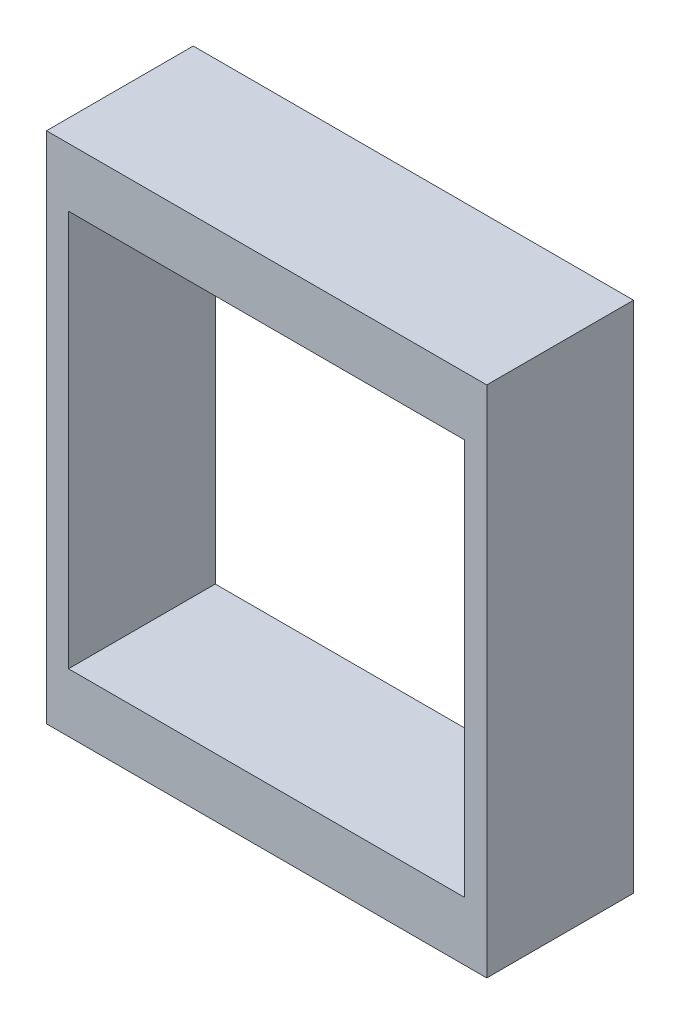
ISO-10303-21;
HEADER;
FILE_DESCRIPTION(('STEP AP214'),'2;1');
FILE_NAME('part.step','',(''),(''),'','','');
FILE_SCHEMA(('AUTOMOTIVE_DESIGN { 1 0 10303 214 1 1 1 1 }'));
ENDSEC;
DATA;
#1=APPLICATION_CONTEXT('core data for automotive mechanical design processes');
#2=APPLICATION_PROTOCOL_DEFINITION('international standard','automotive_design',2000,#1);
#3=PRODUCT_CONTEXT('',#1,'mechanical');
#4=PRODUCT('Part','Part','',(#3));
#5=PRODUCT_RELATED_PRODUCT_CATEGORY('part','',(#4));
#6=PRODUCT_DEFINITION_FORMATION('','',#4);
#7=PRODUCT_DEFINITION_CONTEXT('part definition',#1,'design');
#8=PRODUCT_DEFINITION('design','',#6,#7);
#9=PRODUCT_DEFINITION_SHAPE('','',#8);
#10=(LENGTH_UNIT() NAMED_UNIT(*) SI_UNIT(.MILLI.,.METRE.));
#11=(NAMED_UNIT(*) PLANE_ANGLE_UNIT() SI_UNIT($,.RADIAN.));
#12=(NAMED_UNIT(*) SI_UNIT($,.STERADIAN.) SOLID_ANGLE_UNIT());
#13=UNCERTAINTY_MEASURE_WITH_UNIT(LENGTH_MEASURE(1.E-05),#10,'distance_accuracy_value','');
#14=(GEOMETRIC_REPRESENTATION_CONTEXT(3) GLOBAL_UNCERTAINTY_ASSIGNED_CONTEXT((#13)) GLOBAL_UNIT_ASSIGNED_CONTEXT((#10,
#11,#12)) REPRESENTATION_CONTEXT('',''));
#15=CARTESIAN_POINT('',(0.,0.,0.));
#16=DIRECTION('',(0.,0.,1.));
#17=DIRECTION('',(1.,0.,0.));
#18=AXIS2_PLACEMENT_3D('',#15,#16,#17);
#19=CARTESIAN_POINT('',(0.,0.,20.));
#20=DIRECTION('',(0.,0.,1.));
#21=DIRECTION('',(1.,0.,0.));
#22=AXIS2_PLACEMENT_3D('',#19,#20,#21);
#23=PLANE('',#22);
#24=DIRECTION('',(0.,1.,0.));
#25=VECTOR('',#24,1.);
#26=CARTESIAN_POINT('',(60.,70.,20.));
#27=LINE('',#26,#25);
#28=CARTESIAN_POINT('',(60.,-70.,20.));
#29=VERTEX_POINT('',#28);
#30=CARTESIAN_POINT('',(60.,70.,20.));
#31=VERTEX_POINT('',#30);
#32=EDGE_CURVE('E142',#29,#31,#27,.T.);
#33=ORIENTED_EDGE('',*,*,#32,.T.);
#34=DIRECTION('',(-1.,0.,0.));
#35=VECTOR('',#34,1.);
#36=CARTESIAN_POINT('',(-60.,70.,20.));
#37=LINE('',#36,#35);
#38=CARTESIAN_POINT('',(-60.,70.,20.));
#39=VERTEX_POINT('',#38);
#40=EDGE_CURVE('E144',#31,#39,#37,.T.);
#41=ORIENTED_EDGE('',*,*,#40,.T.);
#42=DIRECTION('',(0.,-1.,0.));
#43=VECTOR('',#42,1.);
#44=CARTESIAN_POINT('',(-60.,70.,20.));
#45=LINE('',#44,#43);
#46=CARTESIAN_POINT('',(-60.,-70.,20.));
#47=VERTEX_POINT('',#46);
#48=EDGE_CURVE('E146',#39,#47,#45,.T.);
#49=ORIENTED_EDGE('',*,*,#48,.T.);
#50=DIRECTION('',(1.,0.,0.));
#51=VECTOR('',#50,1.);
#52=CARTESIAN_POINT('',(-60.,-70.,20.));
#53=LINE('',#52,#51);
#54=EDGE_CURVE('E147',#47,#29,#53,.T.);
#55=ORIENTED_EDGE('',*,*,#54,.T.);
#56=EDGE_LOOP('',(#33,#41,#49,#55));
#57=FACE_BOUND('',#56,.T.);
#58=DIRECTION('',(-1.,0.,0.));
#59=VECTOR('',#58,1.);
#60=CARTESIAN_POINT('',(-54.,54.,20.));
#61=LINE('',#60,#59);
#62=CARTESIAN_POINT('',(54.,54.,20.));
#63=VERTEX_POINT('',#62);
#64=CARTESIAN_POINT('',(-54.,54.,20.));
#65=VERTEX_POINT('',#64);
#66=EDGE_CURVE('E111',#63,#65,#61,.T.);
#67=ORIENTED_EDGE('',*,*,#66,.F.);
#68=DIRECTION('',(0.,1.,0.));
#69=VECTOR('',#68,1.);
#70=CARTESIAN_POINT('',(54.,54.,20.));
#71=LINE('',#70,#69);
#72=CARTESIAN_POINT('',(54.,-54.,20.));
#73=VERTEX_POINT('',#72);
#74=EDGE_CURVE('E106',#73,#63,#71,.T.);
#75=ORIENTED_EDGE('',*,*,#74,.F.);
#76=DIRECTION('',(1.,0.,0.));
#77=VECTOR('',#76,1.);
#78=CARTESIAN_POINT('',(-54.,-54.,20.));
#79=LINE('',#78,#77);
#80=CARTESIAN_POINT('',(-54.,-54.,20.));
#81=VERTEX_POINT('',#80);
#82=EDGE_CURVE('E126',#81,#73,#79,.T.);
#83=ORIENTED_EDGE('',*,*,#82,.F.);
#84=DIRECTION('',(0.,-1.,0.));
#85=VECTOR('',#84,1.);
#86=CARTESIAN_POINT('',(-54.,54.,20.));
#87=LINE('',#86,#85);
#88=EDGE_CURVE('E127',#65,#81,#87,.T.);
#89=ORIENTED_EDGE('',*,*,#88,.F.);
#90=EDGE_LOOP('',(#67,#75,#83,#89));
#91=FACE_BOUND('',#90,.T.);
#92=ADVANCED_FACE('F41',(#57,#91),#23,.T.);
#93=CARTESIAN_POINT('',(0.,0.,-20.));
#94=DIRECTION('',(0.,0.,1.));
#95=DIRECTION('',(1.,0.,0.));
#96=AXIS2_PLACEMENT_3D('',#93,#94,#95);
#97=PLANE('',#96);
#98=DIRECTION('',(0.,1.,0.));
#99=VECTOR('',#98,1.);
#100=CARTESIAN_POINT('',(60.,70.,-20.));
#101=LINE('',#100,#99);
#102=CARTESIAN_POINT('',(60.,-70.,-20.));
#103=VERTEX_POINT('',#102);
#104=CARTESIAN_POINT('',(60.,70.,-20.));
#105=VERTEX_POINT('',#104);
#106=EDGE_CURVE('E125',#103,#105,#101,.T.);
#107=ORIENTED_EDGE('',*,*,#106,.F.);
#108=DIRECTION('',(1.,0.,0.));
#109=VECTOR('',#108,1.);
#110=CARTESIAN_POINT('',(-60.,-70.,-20.));
#111=LINE('',#110,#109);
#112=CARTESIAN_POINT('',(-60.,-70.,-20.));
#113=VERTEX_POINT('',#112);
#114=EDGE_CURVE('E148',#113,#103,#111,.T.);
#115=ORIENTED_EDGE('',*,*,#114,.F.);
#116=DIRECTION('',(0.,-1.,0.));
#117=VECTOR('',#116,1.);
#118=CARTESIAN_POINT('',(-60.,70.,-20.));
#119=LINE('',#118,#117);
#120=CARTESIAN_POINT('',(-60.,70.,-20.));
#121=VERTEX_POINT('',#120);
#122=EDGE_CURVE('E160',#121,#113,#119,.T.);
#123=ORIENTED_EDGE('',*,*,#122,.F.);
#124=DIRECTION('',(-1.,0.,0.));
#125=VECTOR('',#124,1.);
#126=CARTESIAN_POINT('',(-60.,70.,-20.));
#127=LINE('',#126,#125);
#128=EDGE_CURVE('E154',#105,#121,#127,.T.);
#129=ORIENTED_EDGE('',*,*,#128,.F.);
#130=EDGE_LOOP('',(#107,#115,#123,#129));
#131=FACE_BOUND('',#130,.T.);
#132=DIRECTION('',(0.,1.,0.));
#133=VECTOR('',#132,1.);
#134=CARTESIAN_POINT('',(54.,54.,-20.));
#135=LINE('',#134,#133);
#136=CARTESIAN_POINT('',(54.,-54.,-20.));
#137=VERTEX_POINT('',#136);
#138=CARTESIAN_POINT('',(54.,54.,-20.));
#139=VERTEX_POINT('',#138);
#140=EDGE_CURVE('E63',#137,#139,#135,.T.);
#141=ORIENTED_EDGE('',*,*,#140,.T.);
#142=DIRECTION('',(-1.,0.,0.));
#143=VECTOR('',#142,1.);
#144=CARTESIAN_POINT('',(-54.,54.,-20.));
#145=LINE('',#144,#143);
#146=CARTESIAN_POINT('',(-54.,54.,-20.));
#147=VERTEX_POINT('',#146);
#148=EDGE_CURVE('E122',#139,#147,#145,.T.);
#149=ORIENTED_EDGE('',*,*,#148,.T.);
#150=DIRECTION('',(0.,-1.,0.));
#151=VECTOR('',#150,1.);
#152=CARTESIAN_POINT('',(-54.,54.,-20.));
#153=LINE('',#152,#151);
#154=CARTESIAN_POINT('',(-54.,-54.,-20.));
#155=VERTEX_POINT('',#154);
#156=EDGE_CURVE('E133',#147,#155,#153,.T.);
#157=ORIENTED_EDGE('',*,*,#156,.T.);
#158=DIRECTION('',(1.,0.,0.));
#159=VECTOR('',#158,1.);
#160=CARTESIAN_POINT('',(-54.,-54.,-20.));
#161=LINE('',#160,#159);
#162=EDGE_CURVE('E113',#155,#137,#161,.T.);
#163=ORIENTED_EDGE('',*,*,#162,.T.);
#164=EDGE_LOOP('',(#141,#149,#157,#163));
#165=FACE_BOUND('',#164,.T.);
#166=ADVANCED_FACE('F174',(#131,#165),#97,.F.);
#167=CARTESIAN_POINT('',(60.,70.,20.));
#168=DIRECTION('',(-1.,0.,0.));
#169=DIRECTION('',(0.,0.,1.));
#170=AXIS2_PLACEMENT_3D('',#167,#168,#169);
#171=PLANE('',#170);
#172=ORIENTED_EDGE('',*,*,#106,.T.);
#173=DIRECTION('',(0.,0.,-1.));
#174=VECTOR('',#173,1.);
#175=CARTESIAN_POINT('',(60.,70.,20.));
#176=LINE('',#175,#174);
#177=EDGE_CURVE('E11',#31,#105,#176,.T.);
#178=ORIENTED_EDGE('',*,*,#177,.F.);
#179=ORIENTED_EDGE('',*,*,#32,.F.);
#180=DIRECTION('',(0.,0.,-1.));
#181=VECTOR('',#180,1.);
#182=CARTESIAN_POINT('',(60.,-70.,20.));
#183=LINE('',#182,#181);
#184=EDGE_CURVE('E155',#29,#103,#183,.T.);
#185=ORIENTED_EDGE('',*,*,#184,.T.);
#186=EDGE_LOOP('',(#172,#178,#179,#185));
#187=FACE_BOUND('',#186,.T.);
#188=ADVANCED_FACE('F43',(#187),#171,.F.);
#189=CARTESIAN_POINT('',(-60.,70.,20.));
#190=DIRECTION('',(0.,-1.,0.));
#191=DIRECTION('',(0.,0.,-1.));
#192=AXIS2_PLACEMENT_3D('',#189,#190,#191);
#193=PLANE('',#192);
#194=ORIENTED_EDGE('',*,*,#128,.T.);
#195=DIRECTION('',(0.,0.,-1.));
#196=VECTOR('',#195,1.);
#197=CARTESIAN_POINT('',(-60.,70.,20.));
#198=LINE('',#197,#196);
#199=EDGE_CURVE('E47',#39,#121,#198,.T.);
#200=ORIENTED_EDGE('',*,*,#199,.F.);
#201=ORIENTED_EDGE('',*,*,#40,.F.);
#202=ORIENTED_EDGE('',*,*,#177,.T.);
#203=EDGE_LOOP('',(#194,#200,#201,#202));
#204=FACE_BOUND('',#203,.T.);
#205=ADVANCED_FACE('F183',(#204),#193,.F.);
#206=CARTESIAN_POINT('',(-60.,70.,20.));
#207=DIRECTION('',(1.,0.,0.));
#208=DIRECTION('',(0.,0.,-1.));
#209=AXIS2_PLACEMENT_3D('',#206,#207,#208);
#210=PLANE('',#209);
#211=ORIENTED_EDGE('',*,*,#122,.T.);
#212=DIRECTION('',(0.,0.,-1.));
#213=VECTOR('',#212,1.);
#214=CARTESIAN_POINT('',(-60.,-70.,20.));
#215=LINE('',#214,#213);
#216=EDGE_CURVE('E165',#47,#113,#215,.T.);
#217=ORIENTED_EDGE('',*,*,#216,.F.);
#218=ORIENTED_EDGE('',*,*,#48,.F.);
#219=ORIENTED_EDGE('',*,*,#199,.T.);
#220=EDGE_LOOP('',(#211,#217,#218,#219));
#221=FACE_BOUND('',#220,.T.);
#222=ADVANCED_FACE('F166',(#221),#210,.F.);
#223=CARTESIAN_POINT('',(-60.,-70.,20.));
#224=DIRECTION('',(0.,1.,0.));
#225=DIRECTION('',(0.,0.,1.));
#226=AXIS2_PLACEMENT_3D('',#223,#224,#225);
#227=PLANE('',#226);
#228=ORIENTED_EDGE('',*,*,#114,.T.);
#229=ORIENTED_EDGE('',*,*,#184,.F.);
#230=ORIENTED_EDGE('',*,*,#54,.F.);
#231=ORIENTED_EDGE('',*,*,#216,.T.);
#232=EDGE_LOOP('',(#228,#229,#230,#231));
#233=FACE_BOUND('',#232,.T.);
#234=ADVANCED_FACE('F179',(#233),#227,.F.);
#235=CARTESIAN_POINT('',(54.,54.,20.));
#236=DIRECTION('',(-1.,0.,0.));
#237=DIRECTION('',(0.,0.,1.));
#238=AXIS2_PLACEMENT_3D('',#235,#236,#237);
#239=PLANE('',#238);
#240=ORIENTED_EDGE('',*,*,#140,.F.);
#241=DIRECTION('',(0.,0.,-1.));
#242=VECTOR('',#241,1.);
#243=CARTESIAN_POINT('',(54.,-54.,20.));
#244=LINE('',#243,#242);
#245=EDGE_CURVE('E109',#73,#137,#244,.T.);
#246=ORIENTED_EDGE('',*,*,#245,.F.);
#247=ORIENTED_EDGE('',*,*,#74,.T.);
#248=DIRECTION('',(0.,0.,-1.));
#249=VECTOR('',#248,1.);
#250=CARTESIAN_POINT('',(54.,54.,20.));
#251=LINE('',#250,#249);
#252=EDGE_CURVE('E108',#63,#139,#251,.T.);
#253=ORIENTED_EDGE('',*,*,#252,.T.);
#254=EDGE_LOOP('',(#240,#246,#247,#253));
#255=FACE_BOUND('',#254,.T.);
#256=ADVANCED_FACE('F107',(#255),#239,.T.);
#257=CARTESIAN_POINT('',(-54.,54.,20.));
#258=DIRECTION('',(0.,-1.,0.));
#259=DIRECTION('',(0.,0.,-1.));
#260=AXIS2_PLACEMENT_3D('',#257,#258,#259);
#261=PLANE('',#260);
#262=ORIENTED_EDGE('',*,*,#148,.F.);
#263=ORIENTED_EDGE('',*,*,#252,.F.);
#264=ORIENTED_EDGE('',*,*,#66,.T.);
#265=DIRECTION('',(0.,0.,-1.));
#266=VECTOR('',#265,1.);
#267=CARTESIAN_POINT('',(-54.,54.,20.));
#268=LINE('',#267,#266);
#269=EDGE_CURVE('E123',#65,#147,#268,.T.);
#270=ORIENTED_EDGE('',*,*,#269,.T.);
#271=EDGE_LOOP('',(#262,#263,#264,#270));
#272=FACE_BOUND('',#271,.T.);
#273=ADVANCED_FACE('F117',(#272),#261,.T.);
#274=CARTESIAN_POINT('',(-54.,54.,20.));
#275=DIRECTION('',(1.,0.,0.));
#276=DIRECTION('',(0.,0.,-1.));
#277=AXIS2_PLACEMENT_3D('',#274,#275,#276);
#278=PLANE('',#277);
#279=ORIENTED_EDGE('',*,*,#156,.F.);
#280=ORIENTED_EDGE('',*,*,#269,.F.);
#281=ORIENTED_EDGE('',*,*,#88,.T.);
#282=DIRECTION('',(0.,0.,-1.));
#283=VECTOR('',#282,1.);
#284=CARTESIAN_POINT('',(-54.,-54.,20.));
#285=LINE('',#284,#283);
#286=EDGE_CURVE('E57',#81,#155,#285,.T.);
#287=ORIENTED_EDGE('',*,*,#286,.T.);
#288=EDGE_LOOP('',(#279,#280,#281,#287));
#289=FACE_BOUND('',#288,.T.);
#290=ADVANCED_FACE('F208',(#289),#278,.T.);
#291=CARTESIAN_POINT('',(-54.,-54.,20.));
#292=DIRECTION('',(0.,1.,0.));
#293=DIRECTION('',(0.,0.,1.));
#294=AXIS2_PLACEMENT_3D('',#291,#292,#293);
#295=PLANE('',#294);
#296=ORIENTED_EDGE('',*,*,#162,.F.);
#297=ORIENTED_EDGE('',*,*,#286,.F.);
#298=ORIENTED_EDGE('',*,*,#82,.T.);
#299=ORIENTED_EDGE('',*,*,#245,.T.);
#300=EDGE_LOOP('',(#296,#297,#298,#299));
#301=FACE_BOUND('',#300,.T.);
#302=ADVANCED_FACE('F215',(#301),#295,.T.);
#303=CLOSED_SHELL('',(#92,#166,#188,#205,#222,#234,#256,#273,#290,#302));
#304=MANIFOLD_SOLID_BREP('B2',#303);
#305=ADVANCED_BREP_SHAPE_REPRESENTATION('',(#18,#304),#14);
#306=SHAPE_DEFINITION_REPRESENTATION(#9,#305);
ENDSEC;
END-ISO-10303-21;
